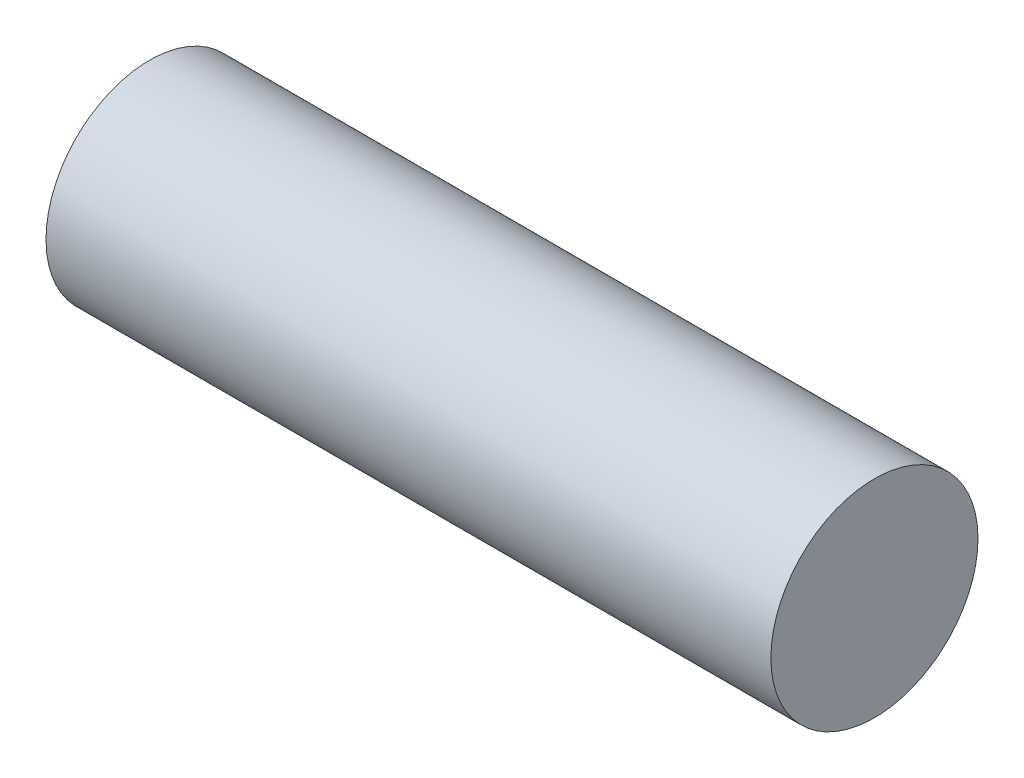
ISO-10303-21;
HEADER;
FILE_DESCRIPTION(('STEP AP214'),'2;1');
FILE_NAME('part.step','',(''),(''),'','','');
FILE_SCHEMA(('AUTOMOTIVE_DESIGN { 1 0 10303 214 1 1 1 1 }'));
ENDSEC;
DATA;
#1=APPLICATION_CONTEXT('core data for automotive mechanical design processes');
#2=APPLICATION_PROTOCOL_DEFINITION('international standard','automotive_design',2000,#1);
#3=PRODUCT_CONTEXT('',#1,'mechanical');
#4=PRODUCT('Part','Part','',(#3));
#5=PRODUCT_RELATED_PRODUCT_CATEGORY('part','',(#4));
#6=PRODUCT_DEFINITION_FORMATION('','',#4);
#7=PRODUCT_DEFINITION_CONTEXT('part definition',#1,'design');
#8=PRODUCT_DEFINITION('design','',#6,#7);
#9=PRODUCT_DEFINITION_SHAPE('','',#8);
#10=(LENGTH_UNIT() NAMED_UNIT(*) SI_UNIT(.MILLI.,.METRE.));
#11=(NAMED_UNIT(*) PLANE_ANGLE_UNIT() SI_UNIT($,.RADIAN.));
#12=(NAMED_UNIT(*) SI_UNIT($,.STERADIAN.) SOLID_ANGLE_UNIT());
#13=UNCERTAINTY_MEASURE_WITH_UNIT(LENGTH_MEASURE(1.E-05),#10,'distance_accuracy_value','');
#14=(GEOMETRIC_REPRESENTATION_CONTEXT(3) GLOBAL_UNCERTAINTY_ASSIGNED_CONTEXT((#13)) GLOBAL_UNIT_ASSIGNED_CONTEXT((#10,
#11,#12)) REPRESENTATION_CONTEXT('',''));
#15=CARTESIAN_POINT('',(0.,0.,0.));
#16=DIRECTION('',(0.,0.,1.));
#17=DIRECTION('',(1.,0.,0.));
#18=AXIS2_PLACEMENT_3D('',#15,#16,#17);
#19=CARTESIAN_POINT('',(14.,0.,0.));
#20=DIRECTION('',(-1.,0.,0.));
#21=DIRECTION('',(0.,0.,1.));
#22=AXIS2_PLACEMENT_3D('',#19,#20,#21);
#23=CYLINDRICAL_SURFACE('',#22,2.);
#24=CARTESIAN_POINT('',(14.,0.,0.));
#25=DIRECTION('',(1.,0.,0.));
#26=DIRECTION('',(0.,0.,-1.));
#27=AXIS2_PLACEMENT_3D('',#24,#25,#26);
#28=CIRCLE('',#27,2.);
#29=CARTESIAN_POINT('',(14.,0.,-2.));
#30=VERTEX_POINT('',#29);
#31=EDGE_CURVE('E10',#30,#30,#28,.T.);
#32=ORIENTED_EDGE('',*,*,#31,.F.);
#33=EDGE_LOOP('',(#32));
#34=FACE_BOUND('',#33,.T.);
#35=CARTESIAN_POINT('',(0.,0.,0.));
#36=DIRECTION('',(1.,0.,0.));
#37=DIRECTION('',(0.,0.,-1.));
#38=AXIS2_PLACEMENT_3D('',#35,#36,#37);
#39=CIRCLE('',#38,2.);
#40=CARTESIAN_POINT('',(0.,0.,-2.));
#41=VERTEX_POINT('',#40);
#42=EDGE_CURVE('E44',#41,#41,#39,.T.);
#43=ORIENTED_EDGE('',*,*,#42,.T.);
#44=EDGE_LOOP('',(#43));
#45=FACE_BOUND('',#44,.T.);
#46=ADVANCED_FACE('F41',(#34,#45),#23,.T.);
#47=CARTESIAN_POINT('',(14.,0.,0.));
#48=DIRECTION('',(1.,0.,0.));
#49=DIRECTION('',(0.,0.,-1.));
#50=AXIS2_PLACEMENT_3D('',#47,#48,#49);
#51=PLANE('',#50);
#52=ORIENTED_EDGE('',*,*,#31,.T.);
#53=EDGE_LOOP('',(#52));
#54=FACE_BOUND('',#53,.T.);
#55=ADVANCED_FACE('F58',(#54),#51,.T.);
#56=CARTESIAN_POINT('',(0.,0.,0.));
#57=DIRECTION('',(1.,0.,0.));
#58=DIRECTION('',(0.,0.,-1.));
#59=AXIS2_PLACEMENT_3D('',#56,#57,#58);
#60=PLANE('',#59);
#61=ORIENTED_EDGE('',*,*,#42,.F.);
#62=EDGE_LOOP('',(#61));
#63=FACE_BOUND('',#62,.T.);
#64=ADVANCED_FACE('F56',(#63),#60,.F.);
#65=CLOSED_SHELL('',(#46,#55,#64));
#66=MANIFOLD_SOLID_BREP('B2',#65);
#67=ADVANCED_BREP_SHAPE_REPRESENTATION('',(#18,#66),#14);
#68=SHAPE_DEFINITION_REPRESENTATION(#9,#67);
ENDSEC;
END-ISO-10303-21;
